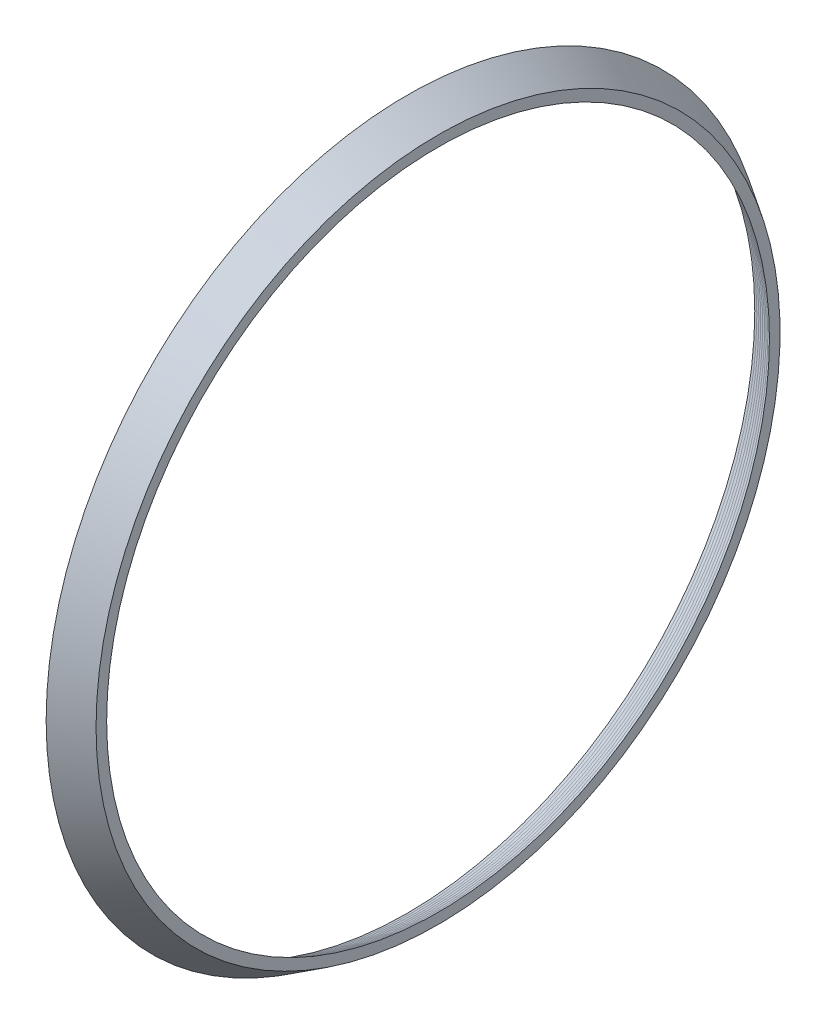
ISO-10303-21;
HEADER;
FILE_DESCRIPTION(('STEP AP214'),'2;1');
FILE_NAME('part.step','',(''),(''),'','','');
FILE_SCHEMA(('AUTOMOTIVE_DESIGN { 1 0 10303 214 1 1 1 1 }'));
ENDSEC;
DATA;
#1=APPLICATION_CONTEXT('core data for automotive mechanical design processes');
#2=APPLICATION_PROTOCOL_DEFINITION('international standard','automotive_design',2000,#1);
#3=PRODUCT_CONTEXT('',#1,'mechanical');
#4=PRODUCT('Part','Part','',(#3));
#5=PRODUCT_RELATED_PRODUCT_CATEGORY('part','',(#4));
#6=PRODUCT_DEFINITION_FORMATION('','',#4);
#7=PRODUCT_DEFINITION_CONTEXT('part definition',#1,'design');
#8=PRODUCT_DEFINITION('design','',#6,#7);
#9=PRODUCT_DEFINITION_SHAPE('','',#8);
#10=(LENGTH_UNIT() NAMED_UNIT(*) SI_UNIT(.MILLI.,.METRE.));
#11=(NAMED_UNIT(*) PLANE_ANGLE_UNIT() SI_UNIT($,.RADIAN.));
#12=(NAMED_UNIT(*) SI_UNIT($,.STERADIAN.) SOLID_ANGLE_UNIT());
#13=UNCERTAINTY_MEASURE_WITH_UNIT(LENGTH_MEASURE(1.E-05),#10,'distance_accuracy_value','');
#14=(GEOMETRIC_REPRESENTATION_CONTEXT(3) GLOBAL_UNCERTAINTY_ASSIGNED_CONTEXT((#13)) GLOBAL_UNIT_ASSIGNED_CONTEXT((#10,
#11,#12)) REPRESENTATION_CONTEXT('',''));
#15=CARTESIAN_POINT('',(0.,0.,0.));
#16=DIRECTION('',(0.,0.,1.));
#17=DIRECTION('',(1.,0.,0.));
#18=AXIS2_PLACEMENT_3D('',#15,#16,#17);
#19=CARTESIAN_POINT('',(3.175,70.5115,0.));
#20=DIRECTION('',(-1.,0.,0.));
#21=DIRECTION('',(0.,0.,1.));
#22=AXIS2_PLACEMENT_3D('',#19,#20,#21);
#23=PLANE('',#22);
#24=CARTESIAN_POINT('',(3.17499999999998,0.,0.));
#25=DIRECTION('',(-1.,0.,0.));
#26=DIRECTION('',(0.,0.,1.));
#27=AXIS2_PLACEMENT_3D('',#24,#25,#26);
#28=CIRCLE('',#27,70.5115);
#29=CARTESIAN_POINT('',(3.17499999999998,0.,70.5115));
#30=VERTEX_POINT('',#29);
#31=EDGE_CURVE('E78',#30,#30,#28,.T.);
#32=ORIENTED_EDGE('',*,*,#31,.F.);
#33=EDGE_LOOP('',(#32));
#34=FACE_BOUND('',#33,.T.);
#35=CARTESIAN_POINT('',(3.17499999999998,0.,0.));
#36=DIRECTION('',(-1.,0.,0.));
#37=DIRECTION('',(0.,0.,1.));
#38=AXIS2_PLACEMENT_3D('',#35,#36,#37);
#39=CIRCLE('',#38,68.3220862833758);
#40=CARTESIAN_POINT('',(3.17499999999998,0.,68.3220862833758));
#41=VERTEX_POINT('',#40);
#42=EDGE_CURVE('E10',#41,#41,#39,.T.);
#43=ORIENTED_EDGE('',*,*,#42,.T.);
#44=EDGE_LOOP('',(#43));
#45=FACE_BOUND('',#44,.T.);
#46=ADVANCED_FACE('F39',(#34,#45),#23,.F.);
#47=CARTESIAN_POINT('',(2.38125,0.,0.));
#48=DIRECTION('',(-1.,0.,0.));
#49=DIRECTION('',(0.,0.,1.));
#50=AXIS2_PLACEMENT_3D('',#47,#48,#49);
#51=CONICAL_SURFACE('',#50,68.7898225011171,0.532495384869229);
#52=ORIENTED_EDGE('',*,*,#42,.F.);
#53=EDGE_LOOP('',(#52));
#54=FACE_BOUND('',#53,.T.);
#55=CARTESIAN_POINT('',(2.38125,0.,0.));
#56=DIRECTION('',(-1.,0.,0.));
#57=DIRECTION('',(0.,0.,1.));
#58=AXIS2_PLACEMENT_3D('',#55,#56,#57);
#59=CIRCLE('',#58,68.7898225011171);
#60=CARTESIAN_POINT('',(2.38125,0.,68.7898225011171));
#61=VERTEX_POINT('',#60);
#62=EDGE_CURVE('E44',#61,#61,#59,.T.);
#63=ORIENTED_EDGE('',*,*,#62,.T.);
#64=EDGE_LOOP('',(#63));
#65=FACE_BOUND('',#64,.T.);
#66=ADVANCED_FACE('F81',(#54,#65),#51,.F.);
#67=CARTESIAN_POINT('',(1.58750000000002,0.,0.));
#68=DIRECTION('',(-1.,0.,0.));
#69=DIRECTION('',(0.,0.,1.));
#70=AXIS2_PLACEMENT_3D('',#67,#68,#69);
#71=CONICAL_SURFACE('',#70,69.2417312491679,0.51756559608724);
#72=ORIENTED_EDGE('',*,*,#62,.F.);
#73=EDGE_LOOP('',(#72));
#74=FACE_BOUND('',#73,.T.);
#75=CARTESIAN_POINT('',(1.58750000000002,0.,0.));
#76=DIRECTION('',(-1.,0.,0.));
#77=DIRECTION('',(0.,0.,1.));
#78=AXIS2_PLACEMENT_3D('',#75,#76,#77);
#79=CIRCLE('',#78,69.2417312491679);
#80=CARTESIAN_POINT('',(1.58750000000002,0.,69.2417312491679));
#81=VERTEX_POINT('',#80);
#82=EDGE_CURVE('E47',#81,#81,#79,.T.);
#83=ORIENTED_EDGE('',*,*,#82,.T.);
#84=EDGE_LOOP('',(#83));
#85=FACE_BOUND('',#84,.T.);
#86=ADVANCED_FACE('F90',(#74,#85),#71,.F.);
#87=CARTESIAN_POINT('',(0.793749999999982,0.,0.));
#88=DIRECTION('',(-1.,0.,0.));
#89=DIRECTION('',(0.,0.,1.));
#90=AXIS2_PLACEMENT_3D('',#87,#88,#89);
#91=CONICAL_SURFACE('',#90,69.6783049247727,0.502854020462128);
#92=ORIENTED_EDGE('',*,*,#82,.F.);
#93=EDGE_LOOP('',(#92));
#94=FACE_BOUND('',#93,.T.);
#95=CARTESIAN_POINT('',(0.793749999999982,0.,0.));
#96=DIRECTION('',(-1.,0.,0.));
#97=DIRECTION('',(0.,0.,1.));
#98=AXIS2_PLACEMENT_3D('',#95,#96,#97);
#99=CIRCLE('',#98,69.6783049247727);
#100=CARTESIAN_POINT('',(0.793749999999982,0.,69.6783049247727));
#101=VERTEX_POINT('',#100);
#102=EDGE_CURVE('E52',#101,#101,#99,.T.);
#103=ORIENTED_EDGE('',*,*,#102,.T.);
#104=EDGE_LOOP('',(#103));
#105=FACE_BOUND('',#104,.T.);
#106=ADVANCED_FACE('F95',(#94,#105),#91,.F.);
#107=CARTESIAN_POINT('',(0.,0.,0.));
#108=DIRECTION('',(-1.,0.,0.));
#109=DIRECTION('',(0.,0.,1.));
#110=AXIS2_PLACEMENT_3D('',#107,#108,#109);
#111=CONICAL_SURFACE('',#110,70.1,0.48834907003614);
#112=ORIENTED_EDGE('',*,*,#102,.F.);
#113=EDGE_LOOP('',(#112));
#114=FACE_BOUND('',#113,.T.);
#115=CARTESIAN_POINT('',(0.,0.,0.));
#116=DIRECTION('',(-1.,0.,0.));
#117=DIRECTION('',(0.,0.,1.));
#118=AXIS2_PLACEMENT_3D('',#115,#116,#117);
#119=CIRCLE('',#118,70.1);
#120=CARTESIAN_POINT('',(0.,0.,70.1));
#121=VERTEX_POINT('',#120);
#122=EDGE_CURVE('E59',#121,#121,#119,.T.);
#123=ORIENTED_EDGE('',*,*,#122,.T.);
#124=EDGE_LOOP('',(#123));
#125=FACE_BOUND('',#124,.T.);
#126=ADVANCED_FACE('F97',(#114,#125),#111,.F.);
#127=CARTESIAN_POINT('',(-0.793749999999982,0.,0.));
#128=DIRECTION('',(-1.,0.,0.));
#129=DIRECTION('',(0.,0.,1.));
#130=AXIS2_PLACEMENT_3D('',#127,#128,#129);
#131=CONICAL_SURFACE('',#130,70.5072403423813,0.474039908195347);
#132=ORIENTED_EDGE('',*,*,#122,.F.);
#133=EDGE_LOOP('',(#132));
#134=FACE_BOUND('',#133,.T.);
#135=CARTESIAN_POINT('',(-0.793749999999982,0.,0.));
#136=DIRECTION('',(-1.,0.,0.));
#137=DIRECTION('',(0.,0.,1.));
#138=AXIS2_PLACEMENT_3D('',#135,#136,#137);
#139=CIRCLE('',#138,70.5072403423813);
#140=CARTESIAN_POINT('',(-0.793749999999982,0.,70.5072403423813));
#141=VERTEX_POINT('',#140);
#142=EDGE_CURVE('E62',#141,#141,#139,.T.);
#143=ORIENTED_EDGE('',*,*,#142,.T.);
#144=EDGE_LOOP('',(#143));
#145=FACE_BOUND('',#144,.T.);
#146=ADVANCED_FACE('F105',(#134,#145),#131,.F.);
#147=CARTESIAN_POINT('',(-1.58750000000002,0.,0.));
#148=DIRECTION('',(-1.,0.,0.));
#149=DIRECTION('',(0.,0.,1.));
#150=AXIS2_PLACEMENT_3D('',#147,#148,#149);
#151=CONICAL_SURFACE('',#150,70.9004201385939,0.459916378292904);
#152=ORIENTED_EDGE('',*,*,#142,.F.);
#153=EDGE_LOOP('',(#152));
#154=FACE_BOUND('',#153,.T.);
#155=CARTESIAN_POINT('',(-1.58750000000002,0.,0.));
#156=DIRECTION('',(-1.,0.,0.));
#157=DIRECTION('',(0.,0.,1.));
#158=AXIS2_PLACEMENT_3D('',#155,#156,#157);
#159=CIRCLE('',#158,70.9004201385939);
#160=CARTESIAN_POINT('',(-1.58750000000002,0.,70.9004201385939));
#161=VERTEX_POINT('',#160);
#162=EDGE_CURVE('E64',#161,#161,#159,.T.);
#163=ORIENTED_EDGE('',*,*,#162,.T.);
#164=EDGE_LOOP('',(#163));
#165=FACE_BOUND('',#164,.T.);
#166=ADVANCED_FACE('F107',(#154,#165),#151,.F.);
#167=CARTESIAN_POINT('',(-2.38125,0.,0.));
#168=DIRECTION('',(-1.,0.,0.));
#169=DIRECTION('',(0.,0.,1.));
#170=AXIS2_PLACEMENT_3D('',#167,#168,#169);
#171=CONICAL_SURFACE('',#170,71.2799064773881,0.445968940571249);
#172=ORIENTED_EDGE('',*,*,#162,.F.);
#173=EDGE_LOOP('',(#172));
#174=FACE_BOUND('',#173,.T.);
#175=CARTESIAN_POINT('',(-2.38125,0.,0.));
#176=DIRECTION('',(-1.,0.,0.));
#177=DIRECTION('',(0.,0.,1.));
#178=AXIS2_PLACEMENT_3D('',#175,#176,#177);
#179=CIRCLE('',#178,71.2799064773881);
#180=CARTESIAN_POINT('',(-2.38125,0.,71.2799064773881));
#181=VERTEX_POINT('',#180);
#182=EDGE_CURVE('E70',#181,#181,#179,.T.);
#183=ORIENTED_EDGE('',*,*,#182,.T.);
#184=EDGE_LOOP('',(#183));
#185=FACE_BOUND('',#184,.T.);
#186=ADVANCED_FACE('F106',(#174,#185),#171,.F.);
#187=CARTESIAN_POINT('',(-3.17499999999998,0.,0.));
#188=DIRECTION('',(-1.,0.,0.));
#189=DIRECTION('',(0.,0.,1.));
#190=AXIS2_PLACEMENT_3D('',#187,#188,#189);
#191=CONICAL_SURFACE('',#190,71.6460416387531,0.432188616220203);
#192=ORIENTED_EDGE('',*,*,#182,.F.);
#193=EDGE_LOOP('',(#192));
#194=FACE_BOUND('',#193,.T.);
#195=CARTESIAN_POINT('',(-3.17499999999998,0.,0.));
#196=DIRECTION('',(-1.,0.,0.));
#197=DIRECTION('',(0.,0.,1.));
#198=AXIS2_PLACEMENT_3D('',#195,#196,#197);
#199=CIRCLE('',#198,71.6460416387531);
#200=CARTESIAN_POINT('',(-3.17499999999998,0.,71.6460416387531));
#201=VERTEX_POINT('',#200);
#202=EDGE_CURVE('E68',#201,#201,#199,.T.);
#203=ORIENTED_EDGE('',*,*,#202,.T.);
#204=EDGE_LOOP('',(#203));
#205=FACE_BOUND('',#204,.T.);
#206=ADVANCED_FACE('F114',(#194,#205),#191,.F.);
#207=CARTESIAN_POINT('',(-3.175,71.6460416387531,0.));
#208=DIRECTION('',(1.,0.,0.));
#209=DIRECTION('',(0.,0.,-1.));
#210=AXIS2_PLACEMENT_3D('',#207,#208,#209);
#211=PLANE('',#210);
#212=ORIENTED_EDGE('',*,*,#202,.F.);
#213=EDGE_LOOP('',(#212));
#214=FACE_BOUND('',#213,.T.);
#215=CARTESIAN_POINT('',(-3.17499999999998,0.,0.));
#216=DIRECTION('',(-1.,0.,0.));
#217=DIRECTION('',(0.,0.,1.));
#218=AXIS2_PLACEMENT_3D('',#215,#216,#217);
#219=CIRCLE('',#218,74.4485);
#220=CARTESIAN_POINT('',(-3.17499999999998,0.,74.4485));
#221=VERTEX_POINT('',#220);
#222=EDGE_CURVE('E73',#221,#221,#219,.T.);
#223=ORIENTED_EDGE('',*,*,#222,.T.);
#224=EDGE_LOOP('',(#223));
#225=FACE_BOUND('',#224,.T.);
#226=ADVANCED_FACE('F118',(#214,#225),#211,.F.);
#227=CARTESIAN_POINT('',(3.17499999999998,0.,0.));
#228=DIRECTION('',(-1.,0.,0.));
#229=DIRECTION('',(0.,0.,1.));
#230=AXIS2_PLACEMENT_3D('',#227,#228,#229);
#231=CONICAL_SURFACE('',#230,70.5115,0.55499572733859);
#232=ORIENTED_EDGE('',*,*,#222,.F.);
#233=EDGE_LOOP('',(#232));
#234=FACE_BOUND('',#233,.T.);
#235=ORIENTED_EDGE('',*,*,#31,.T.);
#236=EDGE_LOOP('',(#235));
#237=FACE_BOUND('',#236,.T.);
#238=ADVANCED_FACE('F79',(#234,#237),#231,.T.);
#239=CLOSED_SHELL('',(#46,#66,#86,#106,#126,#146,#166,#186,#206,#226,#238));
#240=MANIFOLD_SOLID_BREP('B2',#239);
#241=ADVANCED_BREP_SHAPE_REPRESENTATION('',(#18,#240),#14);
#242=SHAPE_DEFINITION_REPRESENTATION(#9,#241);
ENDSEC;
END-ISO-10303-21;
